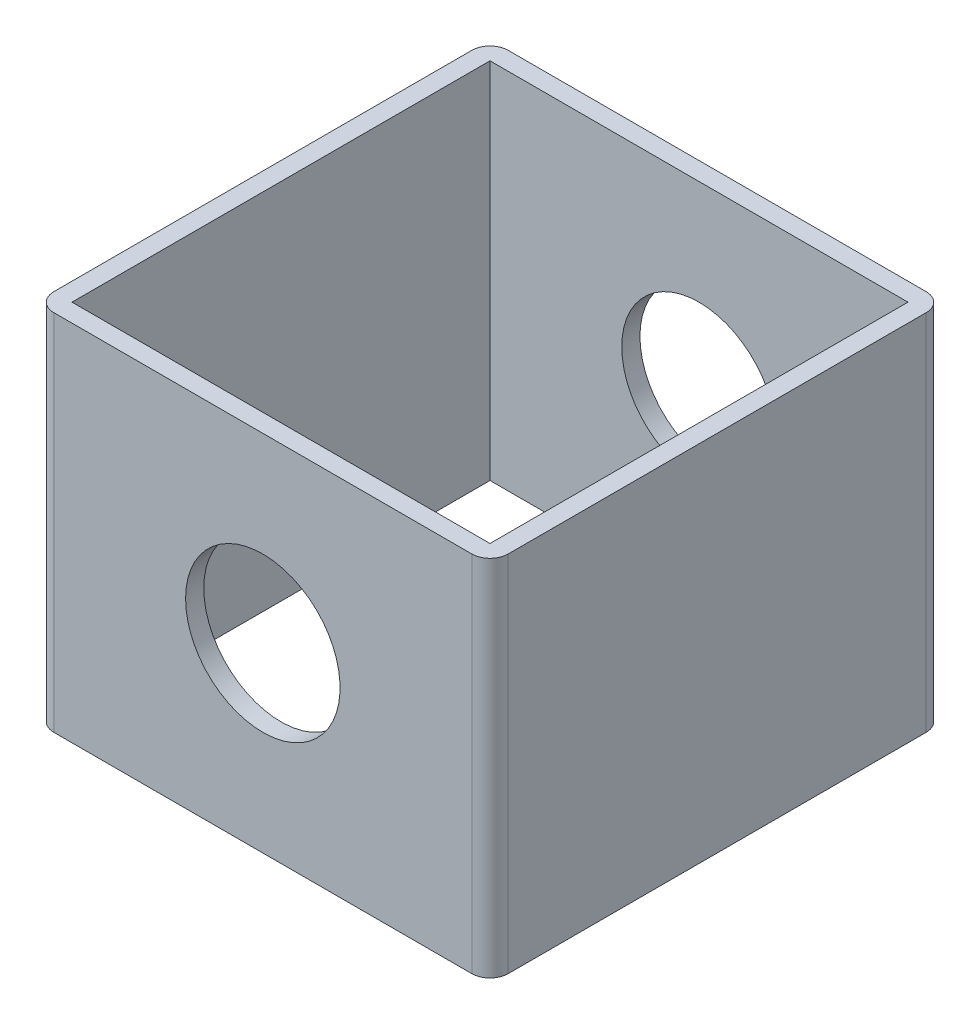
ISO-10303-21;
HEADER;
FILE_DESCRIPTION(('STEP AP214'),'2;1');
FILE_NAME('part.step','',(''),(''),'','','');
FILE_SCHEMA(('AUTOMOTIVE_DESIGN { 1 0 10303 214 1 1 1 1 }'));
ENDSEC;
DATA;
#1=APPLICATION_CONTEXT('core data for automotive mechanical design processes');
#2=APPLICATION_PROTOCOL_DEFINITION('international standard','automotive_design',2000,#1);
#3=PRODUCT_CONTEXT('',#1,'mechanical');
#4=PRODUCT('Part','Part','',(#3));
#5=PRODUCT_RELATED_PRODUCT_CATEGORY('part','',(#4));
#6=PRODUCT_DEFINITION_FORMATION('','',#4);
#7=PRODUCT_DEFINITION_CONTEXT('part definition',#1,'design');
#8=PRODUCT_DEFINITION('design','',#6,#7);
#9=PRODUCT_DEFINITION_SHAPE('','',#8);
#10=(LENGTH_UNIT() NAMED_UNIT(*) SI_UNIT(.MILLI.,.METRE.));
#11=(NAMED_UNIT(*) PLANE_ANGLE_UNIT() SI_UNIT($,.RADIAN.));
#12=(NAMED_UNIT(*) SI_UNIT($,.STERADIAN.) SOLID_ANGLE_UNIT());
#13=UNCERTAINTY_MEASURE_WITH_UNIT(LENGTH_MEASURE(1.E-05),#10,'distance_accuracy_value','');
#14=(GEOMETRIC_REPRESENTATION_CONTEXT(3) GLOBAL_UNCERTAINTY_ASSIGNED_CONTEXT((#13)) GLOBAL_UNIT_ASSIGNED_CONTEXT((#10,
#11,#12)) REPRESENTATION_CONTEXT('',''));
#15=CARTESIAN_POINT('',(0.,0.,0.));
#16=DIRECTION('',(0.,0.,1.));
#17=DIRECTION('',(1.,0.,0.));
#18=AXIS2_PLACEMENT_3D('',#15,#16,#17);
#19=CARTESIAN_POINT('',(-23.,20.,23.));
#20=DIRECTION('',(0.,1.,0.));
#21=DIRECTION('',(0.,0.,1.));
#22=AXIS2_PLACEMENT_3D('',#19,#20,#21);
#23=PLANE('',#22);
#24=CARTESIAN_POINT('',(-23.,20.,23.));
#25=DIRECTION('',(0.,1.,0.));
#26=DIRECTION('',(0.,0.,-1.));
#27=AXIS2_PLACEMENT_3D('',#24,#25,#26);
#28=CIRCLE('',#27,1.99999999999999);
#29=CARTESIAN_POINT('',(-25.,20.,23.));
#30=VERTEX_POINT('',#29);
#31=CARTESIAN_POINT('',(-23.,20.,25.));
#32=VERTEX_POINT('',#31);
#33=EDGE_CURVE('E198',#30,#32,#28,.T.);
#34=ORIENTED_EDGE('',*,*,#33,.T.);
#35=DIRECTION('',(1.,0.,0.));
#36=VECTOR('',#35,1.);
#37=CARTESIAN_POINT('',(23.,20.,25.));
#38=LINE('',#37,#36);
#39=CARTESIAN_POINT('',(23.,20.,25.));
#40=VERTEX_POINT('',#39);
#41=EDGE_CURVE('E201',#32,#40,#38,.T.);
#42=ORIENTED_EDGE('',*,*,#41,.T.);
#43=CARTESIAN_POINT('',(23.,20.,23.));
#44=DIRECTION('',(0.,1.,0.));
#45=DIRECTION('',(0.,0.,1.));
#46=AXIS2_PLACEMENT_3D('',#43,#44,#45);
#47=CIRCLE('',#46,2.);
#48=CARTESIAN_POINT('',(25.,20.,23.));
#49=VERTEX_POINT('',#48);
#50=EDGE_CURVE('E204',#40,#49,#47,.T.);
#51=ORIENTED_EDGE('',*,*,#50,.T.);
#52=DIRECTION('',(0.,0.,-1.));
#53=VECTOR('',#52,1.);
#54=CARTESIAN_POINT('',(25.,20.,23.));
#55=LINE('',#54,#53);
#56=CARTESIAN_POINT('',(25.,20.,-23.));
#57=VERTEX_POINT('',#56);
#58=EDGE_CURVE('E206',#49,#57,#55,.T.);
#59=ORIENTED_EDGE('',*,*,#58,.T.);
#60=CARTESIAN_POINT('',(23.,20.,-23.));
#61=DIRECTION('',(0.,1.,0.));
#62=DIRECTION('',(0.,0.,1.));
#63=AXIS2_PLACEMENT_3D('',#60,#61,#62);
#64=CIRCLE('',#63,2.);
#65=CARTESIAN_POINT('',(23.,20.,-25.));
#66=VERTEX_POINT('',#65);
#67=EDGE_CURVE('E208',#57,#66,#64,.T.);
#68=ORIENTED_EDGE('',*,*,#67,.T.);
#69=DIRECTION('',(-1.,0.,0.));
#70=VECTOR('',#69,1.);
#71=CARTESIAN_POINT('',(23.,20.,-25.));
#72=LINE('',#71,#70);
#73=CARTESIAN_POINT('',(-23.,20.,-25.));
#74=VERTEX_POINT('',#73);
#75=EDGE_CURVE('E210',#66,#74,#72,.T.);
#76=ORIENTED_EDGE('',*,*,#75,.T.);
#77=CARTESIAN_POINT('',(-23.,20.,-23.));
#78=DIRECTION('',(0.,1.,0.));
#79=DIRECTION('',(0.,0.,1.));
#80=AXIS2_PLACEMENT_3D('',#77,#78,#79);
#81=CIRCLE('',#80,2.);
#82=CARTESIAN_POINT('',(-25.,20.,-23.));
#83=VERTEX_POINT('',#82);
#84=EDGE_CURVE('E212',#74,#83,#81,.T.);
#85=ORIENTED_EDGE('',*,*,#84,.T.);
#86=DIRECTION('',(0.,0.,1.));
#87=VECTOR('',#86,1.);
#88=CARTESIAN_POINT('',(-25.,20.,23.));
#89=LINE('',#88,#87);
#90=EDGE_CURVE('E214',#83,#30,#89,.T.);
#91=ORIENTED_EDGE('',*,*,#90,.T.);
#92=EDGE_LOOP('',(#34,#42,#51,#59,#68,#76,#85,#91));
#93=FACE_BOUND('',#92,.T.);
#94=DIRECTION('',(1.,0.,0.));
#95=VECTOR('',#94,1.);
#96=CARTESIAN_POINT('',(-23.,20.,23.));
#97=LINE('',#96,#95);
#98=CARTESIAN_POINT('',(-23.,20.,23.));
#99=VERTEX_POINT('',#98);
#100=CARTESIAN_POINT('',(23.,20.,23.));
#101=VERTEX_POINT('',#100);
#102=EDGE_CURVE('E168',#99,#101,#97,.T.);
#103=ORIENTED_EDGE('',*,*,#102,.F.);
#104=DIRECTION('',(0.,0.,1.));
#105=VECTOR('',#104,1.);
#106=CARTESIAN_POINT('',(-23.,20.,23.));
#107=LINE('',#106,#105);
#108=CARTESIAN_POINT('',(-23.,20.,-23.));
#109=VERTEX_POINT('',#108);
#110=EDGE_CURVE('E160',#109,#99,#107,.T.);
#111=ORIENTED_EDGE('',*,*,#110,.F.);
#112=DIRECTION('',(-1.,0.,0.));
#113=VECTOR('',#112,1.);
#114=CARTESIAN_POINT('',(-23.,20.,-23.));
#115=LINE('',#114,#113);
#116=CARTESIAN_POINT('',(23.,20.,-23.));
#117=VERTEX_POINT('',#116);
#118=EDGE_CURVE('E182',#117,#109,#115,.T.);
#119=ORIENTED_EDGE('',*,*,#118,.F.);
#120=DIRECTION('',(0.,0.,-1.));
#121=VECTOR('',#120,1.);
#122=CARTESIAN_POINT('',(23.,20.,23.));
#123=LINE('',#122,#121);
#124=EDGE_CURVE('E180',#101,#117,#123,.T.);
#125=ORIENTED_EDGE('',*,*,#124,.F.);
#126=EDGE_LOOP('',(#103,#111,#119,#125));
#127=FACE_BOUND('',#126,.T.);
#128=ADVANCED_FACE('F70',(#93,#127),#23,.T.);
#129=CARTESIAN_POINT('',(-23.,-20.,23.));
#130=DIRECTION('',(0.,1.,0.));
#131=DIRECTION('',(0.,0.,1.));
#132=AXIS2_PLACEMENT_3D('',#129,#130,#131);
#133=PLANE('',#132);
#134=CARTESIAN_POINT('',(-23.,-20.,23.));
#135=DIRECTION('',(0.,1.,0.));
#136=DIRECTION('',(0.,0.,-1.));
#137=AXIS2_PLACEMENT_3D('',#134,#135,#136);
#138=CIRCLE('',#137,1.99999999999999);
#139=CARTESIAN_POINT('',(-25.,-20.,23.));
#140=VERTEX_POINT('',#139);
#141=CARTESIAN_POINT('',(-23.,-20.,25.));
#142=VERTEX_POINT('',#141);
#143=EDGE_CURVE('E176',#140,#142,#138,.T.);
#144=ORIENTED_EDGE('',*,*,#143,.F.);
#145=DIRECTION('',(0.,0.,1.));
#146=VECTOR('',#145,1.);
#147=CARTESIAN_POINT('',(-25.,-20.,23.));
#148=LINE('',#147,#146);
#149=CARTESIAN_POINT('',(-25.,-20.,-23.));
#150=VERTEX_POINT('',#149);
#151=EDGE_CURVE('E202',#150,#140,#148,.T.);
#152=ORIENTED_EDGE('',*,*,#151,.F.);
#153=CARTESIAN_POINT('',(-23.,-20.,-23.));
#154=DIRECTION('',(0.,1.,0.));
#155=DIRECTION('',(0.,0.,1.));
#156=AXIS2_PLACEMENT_3D('',#153,#154,#155);
#157=CIRCLE('',#156,2.);
#158=CARTESIAN_POINT('',(-23.,-20.,-25.));
#159=VERTEX_POINT('',#158);
#160=EDGE_CURVE('E229',#159,#150,#157,.T.);
#161=ORIENTED_EDGE('',*,*,#160,.F.);
#162=DIRECTION('',(-1.,0.,0.));
#163=VECTOR('',#162,1.);
#164=CARTESIAN_POINT('',(23.,-20.,-25.));
#165=LINE('',#164,#163);
#166=CARTESIAN_POINT('',(23.,-20.,-25.));
#167=VERTEX_POINT('',#166);
#168=EDGE_CURVE('E227',#167,#159,#165,.T.);
#169=ORIENTED_EDGE('',*,*,#168,.F.);
#170=CARTESIAN_POINT('',(23.,-20.,-23.));
#171=DIRECTION('',(0.,1.,0.));
#172=DIRECTION('',(0.,0.,1.));
#173=AXIS2_PLACEMENT_3D('',#170,#171,#172);
#174=CIRCLE('',#173,2.);
#175=CARTESIAN_POINT('',(25.,-20.,-23.));
#176=VERTEX_POINT('',#175);
#177=EDGE_CURVE('E225',#176,#167,#174,.T.);
#178=ORIENTED_EDGE('',*,*,#177,.F.);
#179=DIRECTION('',(0.,0.,-1.));
#180=VECTOR('',#179,1.);
#181=CARTESIAN_POINT('',(25.,-20.,23.));
#182=LINE('',#181,#180);
#183=CARTESIAN_POINT('',(25.,-20.,23.));
#184=VERTEX_POINT('',#183);
#185=EDGE_CURVE('E223',#184,#176,#182,.T.);
#186=ORIENTED_EDGE('',*,*,#185,.F.);
#187=CARTESIAN_POINT('',(23.,-20.,23.));
#188=DIRECTION('',(0.,1.,0.));
#189=DIRECTION('',(0.,0.,1.));
#190=AXIS2_PLACEMENT_3D('',#187,#188,#189);
#191=CIRCLE('',#190,2.);
#192=CARTESIAN_POINT('',(23.,-20.,25.));
#193=VERTEX_POINT('',#192);
#194=EDGE_CURVE('E221',#193,#184,#191,.T.);
#195=ORIENTED_EDGE('',*,*,#194,.F.);
#196=DIRECTION('',(1.,0.,0.));
#197=VECTOR('',#196,1.);
#198=CARTESIAN_POINT('',(23.,-20.,25.));
#199=LINE('',#198,#197);
#200=EDGE_CURVE('E219',#142,#193,#199,.T.);
#201=ORIENTED_EDGE('',*,*,#200,.F.);
#202=EDGE_LOOP('',(#144,#152,#161,#169,#178,#186,#195,#201));
#203=FACE_BOUND('',#202,.T.);
#204=DIRECTION('',(0.,0.,1.));
#205=VECTOR('',#204,1.);
#206=CARTESIAN_POINT('',(-23.,-20.,23.));
#207=LINE('',#206,#205);
#208=CARTESIAN_POINT('',(-23.,-20.,-23.));
#209=VERTEX_POINT('',#208);
#210=CARTESIAN_POINT('',(-23.,-20.,23.));
#211=VERTEX_POINT('',#210);
#212=EDGE_CURVE('E94',#209,#211,#207,.T.);
#213=ORIENTED_EDGE('',*,*,#212,.T.);
#214=DIRECTION('',(1.,0.,0.));
#215=VECTOR('',#214,1.);
#216=CARTESIAN_POINT('',(-23.,-20.,23.));
#217=LINE('',#216,#215);
#218=CARTESIAN_POINT('',(23.,-20.,23.));
#219=VERTEX_POINT('',#218);
#220=EDGE_CURVE('E175',#211,#219,#217,.T.);
#221=ORIENTED_EDGE('',*,*,#220,.T.);
#222=DIRECTION('',(0.,0.,-1.));
#223=VECTOR('',#222,1.);
#224=CARTESIAN_POINT('',(23.,-20.,23.));
#225=LINE('',#224,#223);
#226=CARTESIAN_POINT('',(23.,-20.,-23.));
#227=VERTEX_POINT('',#226);
#228=EDGE_CURVE('E190',#219,#227,#225,.T.);
#229=ORIENTED_EDGE('',*,*,#228,.T.);
#230=DIRECTION('',(-1.,0.,0.));
#231=VECTOR('',#230,1.);
#232=CARTESIAN_POINT('',(-23.,-20.,-23.));
#233=LINE('',#232,#231);
#234=EDGE_CURVE('E169',#227,#209,#233,.T.);
#235=ORIENTED_EDGE('',*,*,#234,.T.);
#236=EDGE_LOOP('',(#213,#221,#229,#235));
#237=FACE_BOUND('',#236,.T.);
#238=ADVANCED_FACE('F260',(#203,#237),#133,.F.);
#239=CARTESIAN_POINT('',(-23.,20.,23.));
#240=DIRECTION('',(0.,-1.,0.));
#241=DIRECTION('',(0.,0.,-1.));
#242=AXIS2_PLACEMENT_3D('',#239,#240,#241);
#243=CYLINDRICAL_SURFACE('',#242,1.99999999999999);
#244=ORIENTED_EDGE('',*,*,#143,.T.);
#245=DIRECTION('',(0.,-1.,0.));
#246=VECTOR('',#245,1.);
#247=CARTESIAN_POINT('',(-23.,20.,25.));
#248=LINE('',#247,#246);
#249=EDGE_CURVE('E12',#32,#142,#248,.T.);
#250=ORIENTED_EDGE('',*,*,#249,.F.);
#251=ORIENTED_EDGE('',*,*,#33,.F.);
#252=DIRECTION('',(0.,-1.,0.));
#253=VECTOR('',#252,1.);
#254=CARTESIAN_POINT('',(-25.,20.,23.));
#255=LINE('',#254,#253);
#256=EDGE_CURVE('E216',#30,#140,#255,.T.);
#257=ORIENTED_EDGE('',*,*,#256,.T.);
#258=EDGE_LOOP('',(#244,#250,#251,#257));
#259=FACE_BOUND('',#258,.T.);
#260=ADVANCED_FACE('F72',(#259),#243,.T.);
#261=CARTESIAN_POINT('',(23.,20.,25.));
#262=DIRECTION('',(0.,0.,-1.));
#263=DIRECTION('',(-1.,0.,0.));
#264=AXIS2_PLACEMENT_3D('',#261,#262,#263);
#265=PLANE('',#264);
#266=CARTESIAN_POINT('',(0.,0.,25.));
#267=DIRECTION('',(0.,0.,-1.));
#268=DIRECTION('',(-1.,0.,0.));
#269=AXIS2_PLACEMENT_3D('',#266,#267,#268);
#270=CIRCLE('',#269,8.5);
#271=CARTESIAN_POINT('',(-8.5,0.,25.));
#272=VERTEX_POINT('',#271);
#273=EDGE_CURVE('E343',#272,#272,#270,.T.);
#274=ORIENTED_EDGE('',*,*,#273,.T.);
#275=EDGE_LOOP('',(#274));
#276=FACE_BOUND('',#275,.T.);
#277=ORIENTED_EDGE('',*,*,#200,.T.);
#278=DIRECTION('',(0.,-1.,0.));
#279=VECTOR('',#278,1.);
#280=CARTESIAN_POINT('',(23.,20.,25.));
#281=LINE('',#280,#279);
#282=EDGE_CURVE('E79',#40,#193,#281,.T.);
#283=ORIENTED_EDGE('',*,*,#282,.F.);
#284=ORIENTED_EDGE('',*,*,#41,.F.);
#285=ORIENTED_EDGE('',*,*,#249,.T.);
#286=EDGE_LOOP('',(#277,#283,#284,#285));
#287=FACE_BOUND('',#286,.T.);
#288=ADVANCED_FACE('F277',(#276,#287),#265,.F.);
#289=CARTESIAN_POINT('',(23.,20.,23.));
#290=DIRECTION('',(0.,-1.,0.));
#291=DIRECTION('',(0.,0.,-1.));
#292=AXIS2_PLACEMENT_3D('',#289,#290,#291);
#293=CYLINDRICAL_SURFACE('',#292,2.);
#294=ORIENTED_EDGE('',*,*,#194,.T.);
#295=DIRECTION('',(0.,-1.,0.));
#296=VECTOR('',#295,1.);
#297=CARTESIAN_POINT('',(25.,20.,23.));
#298=LINE('',#297,#296);
#299=EDGE_CURVE('E246',#49,#184,#298,.T.);
#300=ORIENTED_EDGE('',*,*,#299,.F.);
#301=ORIENTED_EDGE('',*,*,#50,.F.);
#302=ORIENTED_EDGE('',*,*,#282,.T.);
#303=EDGE_LOOP('',(#294,#300,#301,#302));
#304=FACE_BOUND('',#303,.T.);
#305=ADVANCED_FACE('F254',(#304),#293,.T.);
#306=CARTESIAN_POINT('',(25.,20.,23.));
#307=DIRECTION('',(-1.,0.,0.));
#308=DIRECTION('',(0.,0.,1.));
#309=AXIS2_PLACEMENT_3D('',#306,#307,#308);
#310=PLANE('',#309);
#311=ORIENTED_EDGE('',*,*,#185,.T.);
#312=DIRECTION('',(0.,-1.,0.));
#313=VECTOR('',#312,1.);
#314=CARTESIAN_POINT('',(25.,20.,-23.));
#315=LINE('',#314,#313);
#316=EDGE_CURVE('E243',#57,#176,#315,.T.);
#317=ORIENTED_EDGE('',*,*,#316,.F.);
#318=ORIENTED_EDGE('',*,*,#58,.F.);
#319=ORIENTED_EDGE('',*,*,#299,.T.);
#320=EDGE_LOOP('',(#311,#317,#318,#319));
#321=FACE_BOUND('',#320,.T.);
#322=ADVANCED_FACE('F266',(#321),#310,.F.);
#323=CARTESIAN_POINT('',(23.,20.,-23.));
#324=DIRECTION('',(0.,-1.,0.));
#325=DIRECTION('',(0.,0.,-1.));
#326=AXIS2_PLACEMENT_3D('',#323,#324,#325);
#327=CYLINDRICAL_SURFACE('',#326,2.);
#328=ORIENTED_EDGE('',*,*,#177,.T.);
#329=DIRECTION('',(0.,-1.,0.));
#330=VECTOR('',#329,1.);
#331=CARTESIAN_POINT('',(23.,20.,-25.));
#332=LINE('',#331,#330);
#333=EDGE_CURVE('E240',#66,#167,#332,.T.);
#334=ORIENTED_EDGE('',*,*,#333,.F.);
#335=ORIENTED_EDGE('',*,*,#67,.F.);
#336=ORIENTED_EDGE('',*,*,#316,.T.);
#337=EDGE_LOOP('',(#328,#334,#335,#336));
#338=FACE_BOUND('',#337,.T.);
#339=ADVANCED_FACE('F270',(#338),#327,.T.);
#340=CARTESIAN_POINT('',(23.,20.,-25.));
#341=DIRECTION('',(0.,0.,1.));
#342=DIRECTION('',(1.,0.,0.));
#343=AXIS2_PLACEMENT_3D('',#340,#341,#342);
#344=PLANE('',#343);
#345=CARTESIAN_POINT('',(0.,0.,-25.));
#346=DIRECTION('',(0.,0.,-1.));
#347=DIRECTION('',(-1.,0.,0.));
#348=AXIS2_PLACEMENT_3D('',#345,#346,#347);
#349=CIRCLE('',#348,8.5);
#350=CARTESIAN_POINT('',(-8.50000000000001,0.,-25.));
#351=VERTEX_POINT('',#350);
#352=EDGE_CURVE('E342',#351,#351,#349,.T.);
#353=ORIENTED_EDGE('',*,*,#352,.F.);
#354=EDGE_LOOP('',(#353));
#355=FACE_BOUND('',#354,.T.);
#356=ORIENTED_EDGE('',*,*,#168,.T.);
#357=DIRECTION('',(0.,-1.,0.));
#358=VECTOR('',#357,1.);
#359=CARTESIAN_POINT('',(-23.,20.,-25.));
#360=LINE('',#359,#358);
#361=EDGE_CURVE('E237',#74,#159,#360,.T.);
#362=ORIENTED_EDGE('',*,*,#361,.F.);
#363=ORIENTED_EDGE('',*,*,#75,.F.);
#364=ORIENTED_EDGE('',*,*,#333,.T.);
#365=EDGE_LOOP('',(#356,#362,#363,#364));
#366=FACE_BOUND('',#365,.T.);
#367=ADVANCED_FACE('F290',(#355,#366),#344,.F.);
#368=CARTESIAN_POINT('',(-23.,20.,-23.));
#369=DIRECTION('',(0.,-1.,0.));
#370=DIRECTION('',(0.,0.,-1.));
#371=AXIS2_PLACEMENT_3D('',#368,#369,#370);
#372=CYLINDRICAL_SURFACE('',#371,2.);
#373=ORIENTED_EDGE('',*,*,#160,.T.);
#374=DIRECTION('',(0.,-1.,0.));
#375=VECTOR('',#374,1.);
#376=CARTESIAN_POINT('',(-25.,20.,-23.));
#377=LINE('',#376,#375);
#378=EDGE_CURVE('E234',#83,#150,#377,.T.);
#379=ORIENTED_EDGE('',*,*,#378,.F.);
#380=ORIENTED_EDGE('',*,*,#84,.F.);
#381=ORIENTED_EDGE('',*,*,#361,.T.);
#382=EDGE_LOOP('',(#373,#379,#380,#381));
#383=FACE_BOUND('',#382,.T.);
#384=ADVANCED_FACE('F288',(#383),#372,.T.);
#385=CARTESIAN_POINT('',(-25.,20.,23.));
#386=DIRECTION('',(1.,0.,0.));
#387=DIRECTION('',(0.,0.,-1.));
#388=AXIS2_PLACEMENT_3D('',#385,#386,#387);
#389=PLANE('',#388);
#390=ORIENTED_EDGE('',*,*,#151,.T.);
#391=ORIENTED_EDGE('',*,*,#256,.F.);
#392=ORIENTED_EDGE('',*,*,#90,.F.);
#393=ORIENTED_EDGE('',*,*,#378,.T.);
#394=EDGE_LOOP('',(#390,#391,#392,#393));
#395=FACE_BOUND('',#394,.T.);
#396=ADVANCED_FACE('F283',(#395),#389,.F.);
#397=CARTESIAN_POINT('',(-23.,20.,23.));
#398=DIRECTION('',(1.,0.,0.));
#399=DIRECTION('',(0.,0.,-1.));
#400=AXIS2_PLACEMENT_3D('',#397,#398,#399);
#401=PLANE('',#400);
#402=ORIENTED_EDGE('',*,*,#212,.F.);
#403=DIRECTION('',(0.,-1.,0.));
#404=VECTOR('',#403,1.);
#405=CARTESIAN_POINT('',(-23.,20.,-23.));
#406=LINE('',#405,#404);
#407=EDGE_CURVE('E164',#109,#209,#406,.T.);
#408=ORIENTED_EDGE('',*,*,#407,.F.);
#409=ORIENTED_EDGE('',*,*,#110,.T.);
#410=DIRECTION('',(0.,-1.,0.));
#411=VECTOR('',#410,1.);
#412=CARTESIAN_POINT('',(-23.,20.,23.));
#413=LINE('',#412,#411);
#414=EDGE_CURVE('E163',#99,#211,#413,.T.);
#415=ORIENTED_EDGE('',*,*,#414,.T.);
#416=EDGE_LOOP('',(#402,#408,#409,#415));
#417=FACE_BOUND('',#416,.T.);
#418=ADVANCED_FACE('F162',(#417),#401,.T.);
#419=CARTESIAN_POINT('',(-23.,20.,23.));
#420=DIRECTION('',(0.,0.,-1.));
#421=DIRECTION('',(-1.,0.,0.));
#422=AXIS2_PLACEMENT_3D('',#419,#420,#421);
#423=PLANE('',#422);
#424=CARTESIAN_POINT('',(0.,0.,23.));
#425=DIRECTION('',(0.,0.,-1.));
#426=DIRECTION('',(-1.,0.,0.));
#427=AXIS2_PLACEMENT_3D('',#424,#425,#426);
#428=CIRCLE('',#427,8.5);
#429=CARTESIAN_POINT('',(-8.5,0.,23.));
#430=VERTEX_POINT('',#429);
#431=EDGE_CURVE('E188',#430,#430,#428,.T.);
#432=ORIENTED_EDGE('',*,*,#431,.F.);
#433=EDGE_LOOP('',(#432));
#434=FACE_BOUND('',#433,.T.);
#435=ORIENTED_EDGE('',*,*,#220,.F.);
#436=ORIENTED_EDGE('',*,*,#414,.F.);
#437=ORIENTED_EDGE('',*,*,#102,.T.);
#438=DIRECTION('',(0.,-1.,0.));
#439=VECTOR('',#438,1.);
#440=CARTESIAN_POINT('',(23.,20.,23.));
#441=LINE('',#440,#439);
#442=EDGE_CURVE('E177',#101,#219,#441,.T.);
#443=ORIENTED_EDGE('',*,*,#442,.T.);
#444=EDGE_LOOP('',(#435,#436,#437,#443));
#445=FACE_BOUND('',#444,.T.);
#446=ADVANCED_FACE('F172',(#434,#445),#423,.T.);
#447=CARTESIAN_POINT('',(23.,20.,23.));
#448=DIRECTION('',(-1.,0.,0.));
#449=DIRECTION('',(0.,0.,1.));
#450=AXIS2_PLACEMENT_3D('',#447,#448,#449);
#451=PLANE('',#450);
#452=ORIENTED_EDGE('',*,*,#228,.F.);
#453=ORIENTED_EDGE('',*,*,#442,.F.);
#454=ORIENTED_EDGE('',*,*,#124,.T.);
#455=DIRECTION('',(0.,-1.,0.));
#456=VECTOR('',#455,1.);
#457=CARTESIAN_POINT('',(23.,20.,-23.));
#458=LINE('',#457,#456);
#459=EDGE_CURVE('E86',#117,#227,#458,.T.);
#460=ORIENTED_EDGE('',*,*,#459,.T.);
#461=EDGE_LOOP('',(#452,#453,#454,#460));
#462=FACE_BOUND('',#461,.T.);
#463=ADVANCED_FACE('F317',(#462),#451,.T.);
#464=CARTESIAN_POINT('',(-23.,20.,-23.));
#465=DIRECTION('',(0.,0.,1.));
#466=DIRECTION('',(1.,0.,0.));
#467=AXIS2_PLACEMENT_3D('',#464,#465,#466);
#468=PLANE('',#467);
#469=CARTESIAN_POINT('',(0.,0.,-23.));
#470=DIRECTION('',(0.,0.,1.));
#471=DIRECTION('',(1.,0.,0.));
#472=AXIS2_PLACEMENT_3D('',#469,#470,#471);
#473=CIRCLE('',#472,8.5);
#474=CARTESIAN_POINT('',(8.49999999999999,0.,-23.));
#475=VERTEX_POINT('',#474);
#476=EDGE_CURVE('E74',#475,#475,#473,.T.);
#477=ORIENTED_EDGE('',*,*,#476,.F.);
#478=EDGE_LOOP('',(#477));
#479=FACE_BOUND('',#478,.T.);
#480=ORIENTED_EDGE('',*,*,#234,.F.);
#481=ORIENTED_EDGE('',*,*,#459,.F.);
#482=ORIENTED_EDGE('',*,*,#118,.T.);
#483=ORIENTED_EDGE('',*,*,#407,.T.);
#484=EDGE_LOOP('',(#480,#481,#482,#483));
#485=FACE_BOUND('',#484,.T.);
#486=ADVANCED_FACE('F322',(#479,#485),#468,.T.);
#487=CARTESIAN_POINT('',(0.,0.,25.));
#488=DIRECTION('',(0.,0.,-1.));
#489=DIRECTION('',(-1.,0.,0.));
#490=AXIS2_PLACEMENT_3D('',#487,#488,#489);
#491=CYLINDRICAL_SURFACE('',#490,8.5);
#492=ORIENTED_EDGE('',*,*,#476,.T.);
#493=EDGE_LOOP('',(#492));
#494=FACE_BOUND('',#493,.T.);
#495=ORIENTED_EDGE('',*,*,#352,.T.);
#496=EDGE_LOOP('',(#495));
#497=FACE_BOUND('',#496,.T.);
#498=ADVANCED_FACE('F329',(#494,#497),#491,.F.);
#499=ORIENTED_EDGE('',*,*,#431,.T.);
#500=EDGE_LOOP('',(#499));
#501=FACE_BOUND('',#500,.T.);
#502=ORIENTED_EDGE('',*,*,#273,.F.);
#503=EDGE_LOOP('',(#502));
#504=FACE_BOUND('',#503,.T.);
#505=ADVANCED_FACE('F332',(#501,#504),#491,.F.);
#506=CLOSED_SHELL('',(#128,#238,#260,#288,#305,#322,#339,#367,#384,#396,#418,#446,#463,#486,
#498,#505));
#507=MANIFOLD_SOLID_BREP('B2',#506);
#508=ADVANCED_BREP_SHAPE_REPRESENTATION('',(#18,#507),#14);
#509=SHAPE_DEFINITION_REPRESENTATION(#9,#508);
ENDSEC;
END-ISO-10303-21;
